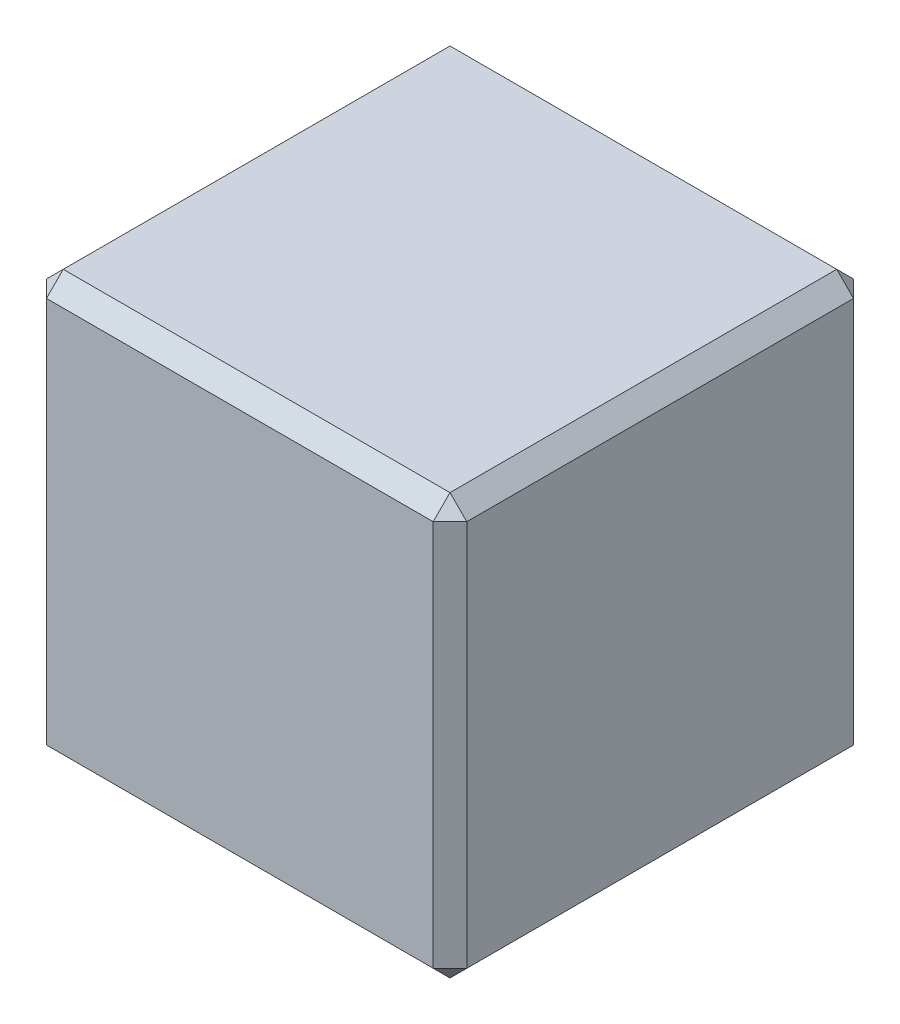
ISO-10303-21;
HEADER;
FILE_DESCRIPTION(('STEP AP214'),'2;1');
FILE_NAME('part.step','',(''),(''),'','','');
FILE_SCHEMA(('AUTOMOTIVE_DESIGN { 1 0 10303 214 1 1 1 1 }'));
ENDSEC;
DATA;
#1=APPLICATION_CONTEXT('core data for automotive mechanical design processes');
#2=APPLICATION_PROTOCOL_DEFINITION('international standard','automotive_design',2000,#1);
#3=PRODUCT_CONTEXT('',#1,'mechanical');
#4=PRODUCT('Part','Part','',(#3));
#5=PRODUCT_RELATED_PRODUCT_CATEGORY('part','',(#4));
#6=PRODUCT_DEFINITION_FORMATION('','',#4);
#7=PRODUCT_DEFINITION_CONTEXT('part definition',#1,'design');
#8=PRODUCT_DEFINITION('design','',#6,#7);
#9=PRODUCT_DEFINITION_SHAPE('','',#8);
#10=(LENGTH_UNIT() NAMED_UNIT(*) SI_UNIT(.MILLI.,.METRE.));
#11=(NAMED_UNIT(*) PLANE_ANGLE_UNIT() SI_UNIT($,.RADIAN.));
#12=(NAMED_UNIT(*) SI_UNIT($,.STERADIAN.) SOLID_ANGLE_UNIT());
#13=UNCERTAINTY_MEASURE_WITH_UNIT(LENGTH_MEASURE(1.E-05),#10,'distance_accuracy_value','');
#14=(GEOMETRIC_REPRESENTATION_CONTEXT(3) GLOBAL_UNCERTAINTY_ASSIGNED_CONTEXT((#13)) GLOBAL_UNIT_ASSIGNED_CONTEXT((#10,
#11,#12)) REPRESENTATION_CONTEXT('',''));
#15=CARTESIAN_POINT('',(0.,0.,0.));
#16=DIRECTION('',(0.,0.,1.));
#17=DIRECTION('',(1.,0.,0.));
#18=AXIS2_PLACEMENT_3D('',#15,#16,#17);
#19=CARTESIAN_POINT('',(0.,0.,50.));
#20=DIRECTION('',(1.,0.,0.));
#21=DIRECTION('',(0.,1.,0.));
#22=AXIS2_PLACEMENT_3D('',#19,#20,#21);
#23=PLANE('',#22);
#24=DIRECTION('',(0.,-1.,0.));
#25=VECTOR('',#24,1.);
#26=CARTESIAN_POINT('',(0.,0.,2.00000000000002));
#27=LINE('',#26,#25);
#28=CARTESIAN_POINT('',(-1.86517468137026E-13,48.,2.00000000000002));
#29=VERTEX_POINT('',#28);
#30=CARTESIAN_POINT('',(0.,2.00000000000001,2.00000000000002));
#31=VERTEX_POINT('',#30);
#32=EDGE_CURVE('E171',#29,#31,#27,.T.);
#33=ORIENTED_EDGE('',*,*,#32,.T.);
#34=DIRECTION('',(0.,0.,1.));
#35=VECTOR('',#34,1.);
#36=CARTESIAN_POINT('',(0.,2.00000000000001,50.));
#37=LINE('',#36,#35);
#38=CARTESIAN_POINT('',(0.,2.00000000000001,48.));
#39=VERTEX_POINT('',#38);
#40=EDGE_CURVE('E173',#31,#39,#37,.T.);
#41=ORIENTED_EDGE('',*,*,#40,.T.);
#42=DIRECTION('',(0.,1.,0.));
#43=VECTOR('',#42,1.);
#44=CARTESIAN_POINT('',(0.,0.,48.));
#45=LINE('',#44,#43);
#46=CARTESIAN_POINT('',(-1.86517468137026E-13,48.,48.));
#47=VERTEX_POINT('',#46);
#48=EDGE_CURVE('E167',#39,#47,#45,.T.);
#49=ORIENTED_EDGE('',*,*,#48,.T.);
#50=DIRECTION('',(0.,0.,-1.));
#51=VECTOR('',#50,1.);
#52=CARTESIAN_POINT('',(-1.86517468137026E-13,48.,50.));
#53=LINE('',#52,#51);
#54=EDGE_CURVE('E169',#47,#29,#53,.T.);
#55=ORIENTED_EDGE('',*,*,#54,.T.);
#56=EDGE_LOOP('',(#33,#41,#49,#55));
#57=FACE_BOUND('',#56,.T.);
#58=ADVANCED_FACE('F35',(#57),#23,.F.);
#59=CARTESIAN_POINT('',(0.,0.,50.));
#60=DIRECTION('',(0.,1.,0.));
#61=DIRECTION('',(0.,0.,1.));
#62=AXIS2_PLACEMENT_3D('',#59,#60,#61);
#63=PLANE('',#62);
#64=DIRECTION('',(-1.,0.,0.));
#65=VECTOR('',#64,1.);
#66=CARTESIAN_POINT('',(0.,0.,48.));
#67=LINE('',#66,#65);
#68=CARTESIAN_POINT('',(47.9999999999998,0.,48.));
#69=VERTEX_POINT('',#68);
#70=CARTESIAN_POINT('',(1.99999999999999,0.,48.));
#71=VERTEX_POINT('',#70);
#72=EDGE_CURVE('E128',#69,#71,#67,.T.);
#73=ORIENTED_EDGE('',*,*,#72,.T.);
#74=DIRECTION('',(0.,0.,-1.));
#75=VECTOR('',#74,1.);
#76=CARTESIAN_POINT('',(1.99999999999999,0.,50.));
#77=LINE('',#76,#75);
#78=CARTESIAN_POINT('',(1.99999999999999,0.,2.));
#79=VERTEX_POINT('',#78);
#80=EDGE_CURVE('E165',#71,#79,#77,.T.);
#81=ORIENTED_EDGE('',*,*,#80,.T.);
#82=DIRECTION('',(1.,0.,0.));
#83=VECTOR('',#82,1.);
#84=CARTESIAN_POINT('',(49.9999999999998,0.,2.));
#85=LINE('',#84,#83);
#86=CARTESIAN_POINT('',(47.9999999999998,0.,2.));
#87=VERTEX_POINT('',#86);
#88=EDGE_CURVE('E131',#79,#87,#85,.T.);
#89=ORIENTED_EDGE('',*,*,#88,.T.);
#90=DIRECTION('',(0.,0.,1.));
#91=VECTOR('',#90,1.);
#92=CARTESIAN_POINT('',(47.9999999999998,0.,50.));
#93=LINE('',#92,#91);
#94=EDGE_CURVE('E123',#87,#69,#93,.T.);
#95=ORIENTED_EDGE('',*,*,#94,.T.);
#96=EDGE_LOOP('',(#73,#81,#89,#95));
#97=FACE_BOUND('',#96,.T.);
#98=ADVANCED_FACE('F125',(#97),#63,.F.);
#99=CARTESIAN_POINT('',(49.9999999999998,0.,50.));
#100=DIRECTION('',(-1.,0.,0.));
#101=DIRECTION('',(0.,-1.,0.));
#102=AXIS2_PLACEMENT_3D('',#99,#100,#101);
#103=PLANE('',#102);
#104=DIRECTION('',(0.,-1.,0.));
#105=VECTOR('',#104,1.);
#106=CARTESIAN_POINT('',(49.9999999999998,0.,48.));
#107=LINE('',#106,#105);
#108=CARTESIAN_POINT('',(49.9999999999998,48.,48.));
#109=VERTEX_POINT('',#108);
#110=CARTESIAN_POINT('',(49.9999999999998,2.,48.));
#111=VERTEX_POINT('',#110);
#112=EDGE_CURVE('E185',#109,#111,#107,.T.);
#113=ORIENTED_EDGE('',*,*,#112,.T.);
#114=DIRECTION('',(0.,0.,-1.));
#115=VECTOR('',#114,1.);
#116=CARTESIAN_POINT('',(49.9999999999998,2.,50.));
#117=LINE('',#116,#115);
#118=CARTESIAN_POINT('',(49.9999999999998,2.,2.));
#119=VERTEX_POINT('',#118);
#120=EDGE_CURVE('E142',#111,#119,#117,.T.);
#121=ORIENTED_EDGE('',*,*,#120,.T.);
#122=DIRECTION('',(0.,1.,0.));
#123=VECTOR('',#122,1.);
#124=CARTESIAN_POINT('',(49.9999999999998,50.,2.));
#125=LINE('',#124,#123);
#126=CARTESIAN_POINT('',(49.9999999999998,48.,2.));
#127=VERTEX_POINT('',#126);
#128=EDGE_CURVE('E189',#119,#127,#125,.T.);
#129=ORIENTED_EDGE('',*,*,#128,.T.);
#130=DIRECTION('',(0.,0.,1.));
#131=VECTOR('',#130,1.);
#132=CARTESIAN_POINT('',(49.9999999999998,48.,50.));
#133=LINE('',#132,#131);
#134=EDGE_CURVE('E187',#127,#109,#133,.T.);
#135=ORIENTED_EDGE('',*,*,#134,.T.);
#136=EDGE_LOOP('',(#113,#121,#129,#135));
#137=FACE_BOUND('',#136,.T.);
#138=ADVANCED_FACE('F328',(#137),#103,.F.);
#139=CARTESIAN_POINT('',(-1.94289029309402E-13,50.,50.));
#140=DIRECTION('',(0.,-1.,0.));
#141=DIRECTION('',(0.,0.,-1.));
#142=AXIS2_PLACEMENT_3D('',#139,#140,#141);
#143=PLANE('',#142);
#144=DIRECTION('',(1.,0.,0.));
#145=VECTOR('',#144,1.);
#146=CARTESIAN_POINT('',(-1.94289029309402E-13,50.,48.));
#147=LINE('',#146,#145);
#148=CARTESIAN_POINT('',(1.99999999999982,50.,48.));
#149=VERTEX_POINT('',#148);
#150=CARTESIAN_POINT('',(47.9999999999998,50.,48.));
#151=VERTEX_POINT('',#150);
#152=EDGE_CURVE('E192',#149,#151,#147,.T.);
#153=ORIENTED_EDGE('',*,*,#152,.T.);
#154=DIRECTION('',(0.,0.,-1.));
#155=VECTOR('',#154,1.);
#156=CARTESIAN_POINT('',(47.9999999999998,50.,50.));
#157=LINE('',#156,#155);
#158=CARTESIAN_POINT('',(47.9999999999998,50.,2.));
#159=VERTEX_POINT('',#158);
#160=EDGE_CURVE('E198',#151,#159,#157,.T.);
#161=ORIENTED_EDGE('',*,*,#160,.T.);
#162=DIRECTION('',(-1.,0.,0.));
#163=VECTOR('',#162,1.);
#164=CARTESIAN_POINT('',(-1.94289029309402E-13,50.,2.));
#165=LINE('',#164,#163);
#166=CARTESIAN_POINT('',(1.99999999999982,50.,2.));
#167=VERTEX_POINT('',#166);
#168=EDGE_CURVE('E196',#159,#167,#165,.T.);
#169=ORIENTED_EDGE('',*,*,#168,.T.);
#170=DIRECTION('',(0.,0.,1.));
#171=VECTOR('',#170,1.);
#172=CARTESIAN_POINT('',(1.99999999999982,50.,50.));
#173=LINE('',#172,#171);
#174=EDGE_CURVE('E194',#167,#149,#173,.T.);
#175=ORIENTED_EDGE('',*,*,#174,.T.);
#176=EDGE_LOOP('',(#153,#161,#169,#175));
#177=FACE_BOUND('',#176,.T.);
#178=ADVANCED_FACE('F276',(#177),#143,.F.);
#179=CARTESIAN_POINT('',(0.,0.,50.));
#180=DIRECTION('',(0.,0.,-1.));
#181=DIRECTION('',(-1.,0.,0.));
#182=AXIS2_PLACEMENT_3D('',#179,#180,#181);
#183=PLANE('',#182);
#184=DIRECTION('',(0.,1.,0.));
#185=VECTOR('',#184,1.);
#186=CARTESIAN_POINT('',(47.9999999999998,0.,50.));
#187=LINE('',#186,#185);
#188=CARTESIAN_POINT('',(47.9999999999998,2.,50.));
#189=VERTEX_POINT('',#188);
#190=CARTESIAN_POINT('',(47.9999999999998,48.,50.));
#191=VERTEX_POINT('',#190);
#192=EDGE_CURVE('E45',#189,#191,#187,.T.);
#193=ORIENTED_EDGE('',*,*,#192,.T.);
#194=DIRECTION('',(-1.,0.,0.));
#195=VECTOR('',#194,1.);
#196=CARTESIAN_POINT('',(0.,48.,50.));
#197=LINE('',#196,#195);
#198=CARTESIAN_POINT('',(1.99999999999982,48.,50.));
#199=VERTEX_POINT('',#198);
#200=EDGE_CURVE('E11',#191,#199,#197,.T.);
#201=ORIENTED_EDGE('',*,*,#200,.T.);
#202=DIRECTION('',(0.,-1.,0.));
#203=VECTOR('',#202,1.);
#204=CARTESIAN_POINT('',(2.,0.,50.));
#205=LINE('',#204,#203);
#206=CARTESIAN_POINT('',(1.99999999999999,2.,50.));
#207=VERTEX_POINT('',#206);
#208=EDGE_CURVE('E201',#199,#207,#205,.T.);
#209=ORIENTED_EDGE('',*,*,#208,.T.);
#210=DIRECTION('',(1.,0.,0.));
#211=VECTOR('',#210,1.);
#212=CARTESIAN_POINT('',(0.,2.,50.));
#213=LINE('',#212,#211);
#214=EDGE_CURVE('E56',#207,#189,#213,.T.);
#215=ORIENTED_EDGE('',*,*,#214,.T.);
#216=EDGE_LOOP('',(#193,#201,#209,#215));
#217=FACE_BOUND('',#216,.T.);
#218=ADVANCED_FACE('F291',(#217),#183,.F.);
#219=CARTESIAN_POINT('',(0.,0.,0.));
#220=DIRECTION('',(0.,0.,-1.));
#221=DIRECTION('',(-1.,0.,0.));
#222=AXIS2_PLACEMENT_3D('',#219,#220,#221);
#223=PLANE('',#222);
#224=DIRECTION('',(0.,-1.,0.));
#225=VECTOR('',#224,1.);
#226=CARTESIAN_POINT('',(47.9999999999998,0.,0.));
#227=LINE('',#226,#225);
#228=CARTESIAN_POINT('',(47.9999999999998,48.,0.));
#229=VERTEX_POINT('',#228);
#230=CARTESIAN_POINT('',(47.9999999999998,2.00000000000002,0.));
#231=VERTEX_POINT('',#230);
#232=EDGE_CURVE('E178',#229,#231,#227,.T.);
#233=ORIENTED_EDGE('',*,*,#232,.T.);
#234=DIRECTION('',(-1.,0.,0.));
#235=VECTOR('',#234,1.);
#236=CARTESIAN_POINT('',(0.,2.00000000000002,0.));
#237=LINE('',#236,#235);
#238=CARTESIAN_POINT('',(1.99999999999999,2.00000000000002,0.));
#239=VERTEX_POINT('',#238);
#240=EDGE_CURVE('E182',#231,#239,#237,.T.);
#241=ORIENTED_EDGE('',*,*,#240,.T.);
#242=DIRECTION('',(0.,1.,0.));
#243=VECTOR('',#242,1.);
#244=CARTESIAN_POINT('',(1.99999999999981,50.,0.));
#245=LINE('',#244,#243);
#246=CARTESIAN_POINT('',(1.99999999999982,48.,0.));
#247=VERTEX_POINT('',#246);
#248=EDGE_CURVE('E180',#239,#247,#245,.T.);
#249=ORIENTED_EDGE('',*,*,#248,.T.);
#250=DIRECTION('',(1.,0.,0.));
#251=VECTOR('',#250,1.);
#252=CARTESIAN_POINT('',(49.9999999999998,48.,0.));
#253=LINE('',#252,#251);
#254=EDGE_CURVE('E176',#247,#229,#253,.T.);
#255=ORIENTED_EDGE('',*,*,#254,.T.);
#256=EDGE_LOOP('',(#233,#241,#249,#255));
#257=FACE_BOUND('',#256,.T.);
#258=ADVANCED_FACE('F267',(#257),#223,.T.);
#259=CARTESIAN_POINT('',(47.9999999999998,50.,50.));
#260=DIRECTION('',(-0.70710678118655,-0.707106781186545,0.));
#261=DIRECTION('',(0.,0.,-1.));
#262=AXIS2_PLACEMENT_3D('',#259,#260,#261);
#263=PLANE('',#262);
#264=DIRECTION('',(0.707106781186545,-0.70710678118655,0.));
#265=VECTOR('',#264,1.);
#266=CARTESIAN_POINT('',(49.9999999999998,48.,48.));
#267=LINE('',#266,#265);
#268=EDGE_CURVE('E40',#109,#151,#267,.F.);
#269=ORIENTED_EDGE('',*,*,#268,.F.);
#270=ORIENTED_EDGE('',*,*,#134,.F.);
#271=DIRECTION('',(-0.707106781186545,0.70710678118655,0.));
#272=VECTOR('',#271,1.);
#273=CARTESIAN_POINT('',(49.9999999999998,48.,2.));
#274=LINE('',#273,#272);
#275=EDGE_CURVE('E162',#159,#127,#274,.F.);
#276=ORIENTED_EDGE('',*,*,#275,.F.);
#277=ORIENTED_EDGE('',*,*,#160,.F.);
#278=EDGE_LOOP('',(#269,#270,#276,#277));
#279=FACE_BOUND('',#278,.T.);
#280=ADVANCED_FACE('F38',(#279),#263,.F.);
#281=CARTESIAN_POINT('',(49.9999999999998,48.,48.));
#282=DIRECTION('',(0.57735026918963,0.577350269189626,0.577350269189622));
#283=DIRECTION('',(-0.707106781186545,0.70710678118655,0.));
#284=AXIS2_PLACEMENT_3D('',#281,#282,#283);
#285=PLANE('',#284);
#286=DIRECTION('',(-0.707106781186545,0.,0.70710678118655));
#287=VECTOR('',#286,1.);
#288=CARTESIAN_POINT('',(49.9999999999998,48.,48.));
#289=LINE('',#288,#287);
#290=EDGE_CURVE('E247',#109,#191,#289,.T.);
#291=ORIENTED_EDGE('',*,*,#290,.F.);
#292=ORIENTED_EDGE('',*,*,#268,.T.);
#293=DIRECTION('',(0.,0.707106781186545,-0.70710678118655));
#294=VECTOR('',#293,1.);
#295=CARTESIAN_POINT('',(47.9999999999998,49.,49.));
#296=LINE('',#295,#294);
#297=EDGE_CURVE('E249',#191,#151,#296,.T.);
#298=ORIENTED_EDGE('',*,*,#297,.F.);
#299=EDGE_LOOP('',(#291,#292,#298));
#300=FACE_BOUND('',#299,.T.);
#301=ADVANCED_FACE('F412',(#300),#285,.T.);
#302=CARTESIAN_POINT('',(49.9999999999998,48.,2.));
#303=DIRECTION('',(0.577350269189626,0.577350269189622,-0.57735026918963));
#304=DIRECTION('',(-0.70710678118655,0.,-0.707106781186545));
#305=AXIS2_PLACEMENT_3D('',#302,#303,#304);
#306=PLANE('',#305);
#307=DIRECTION('',(0.,0.70710678118655,0.707106781186545));
#308=VECTOR('',#307,1.);
#309=CARTESIAN_POINT('',(47.9999999999998,49.,1.));
#310=LINE('',#309,#308);
#311=EDGE_CURVE('E241',#159,#229,#310,.F.);
#312=ORIENTED_EDGE('',*,*,#311,.F.);
#313=ORIENTED_EDGE('',*,*,#275,.T.);
#314=DIRECTION('',(-0.70710678118655,0.,-0.707106781186545));
#315=VECTOR('',#314,1.);
#316=CARTESIAN_POINT('',(49.9999999999998,48.,2.));
#317=LINE('',#316,#315);
#318=EDGE_CURVE('E244',#229,#127,#317,.F.);
#319=ORIENTED_EDGE('',*,*,#318,.F.);
#320=EDGE_LOOP('',(#312,#313,#319));
#321=FACE_BOUND('',#320,.T.);
#322=ADVANCED_FACE('F256',(#321),#306,.T.);
#323=CARTESIAN_POINT('',(0.,48.,50.));
#324=DIRECTION('',(0.,-0.70710678118655,-0.707106781186545));
#325=DIRECTION('',(-1.,0.,0.));
#326=AXIS2_PLACEMENT_3D('',#323,#324,#325);
#327=PLANE('',#326);
#328=ORIENTED_EDGE('',*,*,#297,.T.);
#329=ORIENTED_EDGE('',*,*,#152,.F.);
#330=DIRECTION('',(0.,-0.707106781186545,0.70710678118655));
#331=VECTOR('',#330,1.);
#332=CARTESIAN_POINT('',(1.99999999999982,50.,48.));
#333=LINE('',#332,#331);
#334=EDGE_CURVE('E235',#199,#149,#333,.F.);
#335=ORIENTED_EDGE('',*,*,#334,.F.);
#336=ORIENTED_EDGE('',*,*,#200,.F.);
#337=EDGE_LOOP('',(#328,#329,#335,#336));
#338=FACE_BOUND('',#337,.T.);
#339=ADVANCED_FACE('F290',(#338),#327,.F.);
#340=CARTESIAN_POINT('',(47.9999999999998,0.,50.));
#341=DIRECTION('',(-0.70710678118655,0.,-0.707106781186545));
#342=DIRECTION('',(0.,1.,0.));
#343=AXIS2_PLACEMENT_3D('',#340,#341,#342);
#344=PLANE('',#343);
#345=ORIENTED_EDGE('',*,*,#290,.T.);
#346=ORIENTED_EDGE('',*,*,#192,.F.);
#347=DIRECTION('',(0.707106781186545,0.,-0.70710678118655));
#348=VECTOR('',#347,1.);
#349=CARTESIAN_POINT('',(48.9999999999998,2.,49.));
#350=LINE('',#349,#348);
#351=EDGE_CURVE('E146',#111,#189,#350,.F.);
#352=ORIENTED_EDGE('',*,*,#351,.F.);
#353=ORIENTED_EDGE('',*,*,#112,.F.);
#354=EDGE_LOOP('',(#345,#346,#352,#353));
#355=FACE_BOUND('',#354,.T.);
#356=ADVANCED_FACE('F401',(#355),#344,.F.);
#357=CARTESIAN_POINT('',(49.9999999999998,2.,50.));
#358=DIRECTION('',(-0.707106781186545,0.70710678118655,0.));
#359=DIRECTION('',(0.,0.,-1.));
#360=AXIS2_PLACEMENT_3D('',#357,#358,#359);
#361=PLANE('',#360);
#362=DIRECTION('',(0.70710678118655,0.707106781186545,0.));
#363=VECTOR('',#362,1.);
#364=CARTESIAN_POINT('',(47.9999999999998,0.,2.));
#365=LINE('',#364,#363);
#366=EDGE_CURVE('E147',#119,#87,#365,.F.);
#367=ORIENTED_EDGE('',*,*,#366,.F.);
#368=ORIENTED_EDGE('',*,*,#120,.F.);
#369=DIRECTION('',(-0.70710678118655,-0.707106781186545,0.));
#370=VECTOR('',#369,1.);
#371=CARTESIAN_POINT('',(47.9999999999998,0.,48.));
#372=LINE('',#371,#370);
#373=EDGE_CURVE('E138',#69,#111,#372,.F.);
#374=ORIENTED_EDGE('',*,*,#373,.F.);
#375=ORIENTED_EDGE('',*,*,#94,.F.);
#376=EDGE_LOOP('',(#367,#368,#374,#375));
#377=FACE_BOUND('',#376,.T.);
#378=ADVANCED_FACE('F140',(#377),#361,.F.);
#379=CARTESIAN_POINT('',(49.9999999999998,0.,2.));
#380=DIRECTION('',(0.707106781186545,0.,-0.70710678118655));
#381=DIRECTION('',(0.,-1.,0.));
#382=AXIS2_PLACEMENT_3D('',#379,#380,#381);
#383=PLANE('',#382);
#384=ORIENTED_EDGE('',*,*,#318,.T.);
#385=ORIENTED_EDGE('',*,*,#128,.F.);
#386=DIRECTION('',(0.70710678118655,0.,0.707106781186545));
#387=VECTOR('',#386,1.);
#388=CARTESIAN_POINT('',(48.9999999999998,2.00000000000001,1.));
#389=LINE('',#388,#387);
#390=EDGE_CURVE('E231',#231,#119,#389,.T.);
#391=ORIENTED_EDGE('',*,*,#390,.F.);
#392=ORIENTED_EDGE('',*,*,#232,.F.);
#393=EDGE_LOOP('',(#384,#385,#391,#392));
#394=FACE_BOUND('',#393,.T.);
#395=ADVANCED_FACE('F263',(#394),#383,.T.);
#396=CARTESIAN_POINT('',(-1.94289029309402E-13,50.,2.));
#397=DIRECTION('',(0.,0.707106781186545,-0.70710678118655));
#398=DIRECTION('',(1.,0.,0.));
#399=AXIS2_PLACEMENT_3D('',#396,#397,#398);
#400=PLANE('',#399);
#401=ORIENTED_EDGE('',*,*,#311,.T.);
#402=ORIENTED_EDGE('',*,*,#254,.F.);
#403=DIRECTION('',(0.,-0.70710678118655,-0.707106781186545));
#404=VECTOR('',#403,1.);
#405=CARTESIAN_POINT('',(1.99999999999982,48.,0.));
#406=LINE('',#405,#404);
#407=EDGE_CURVE('E228',#167,#247,#406,.T.);
#408=ORIENTED_EDGE('',*,*,#407,.F.);
#409=ORIENTED_EDGE('',*,*,#168,.F.);
#410=EDGE_LOOP('',(#401,#402,#408,#409));
#411=FACE_BOUND('',#410,.T.);
#412=ADVANCED_FACE('F273',(#411),#400,.T.);
#413=CARTESIAN_POINT('',(-1.86517468137026E-13,48.,50.));
#414=DIRECTION('',(0.707106781186551,-0.707106781186544,0.));
#415=DIRECTION('',(0.,0.,-1.));
#416=AXIS2_PLACEMENT_3D('',#413,#414,#415);
#417=PLANE('',#416);
#418=DIRECTION('',(0.707106781186544,0.707106781186551,0.));
#419=VECTOR('',#418,1.);
#420=CARTESIAN_POINT('',(1.99999999999982,50.,48.));
#421=LINE('',#420,#419);
#422=EDGE_CURVE('E238',#149,#47,#421,.F.);
#423=ORIENTED_EDGE('',*,*,#422,.F.);
#424=ORIENTED_EDGE('',*,*,#174,.F.);
#425=DIRECTION('',(-0.707106781186544,-0.707106781186551,0.));
#426=VECTOR('',#425,1.);
#427=CARTESIAN_POINT('',(0.999999999999814,49.,2.00000000000001));
#428=LINE('',#427,#426);
#429=EDGE_CURVE('E225',#29,#167,#428,.F.);
#430=ORIENTED_EDGE('',*,*,#429,.F.);
#431=ORIENTED_EDGE('',*,*,#54,.F.);
#432=EDGE_LOOP('',(#423,#424,#430,#431));
#433=FACE_BOUND('',#432,.T.);
#434=ADVANCED_FACE('F281',(#433),#417,.F.);
#435=CARTESIAN_POINT('',(1.99999999999982,50.,48.));
#436=DIRECTION('',(-0.577350269189631,0.577350269189625,0.577350269189621));
#437=DIRECTION('',(-0.707106781186544,-0.707106781186551,0.));
#438=AXIS2_PLACEMENT_3D('',#435,#436,#437);
#439=PLANE('',#438);
#440=ORIENTED_EDGE('',*,*,#334,.T.);
#441=ORIENTED_EDGE('',*,*,#422,.T.);
#442=DIRECTION('',(-0.707106781186545,0.,-0.70710678118655));
#443=VECTOR('',#442,1.);
#444=CARTESIAN_POINT('',(0.999999999999818,48.,49.));
#445=LINE('',#444,#443);
#446=EDGE_CURVE('E153',#199,#47,#445,.T.);
#447=ORIENTED_EDGE('',*,*,#446,.F.);
#448=EDGE_LOOP('',(#440,#441,#447));
#449=FACE_BOUND('',#448,.T.);
#450=ADVANCED_FACE('F287',(#449),#439,.T.);
#451=CARTESIAN_POINT('',(47.9999999999998,0.,48.));
#452=DIRECTION('',(0.577350269189626,-0.57735026918963,0.577350269189622));
#453=DIRECTION('',(0.70710678118655,0.707106781186545,0.));
#454=AXIS2_PLACEMENT_3D('',#451,#452,#453);
#455=PLANE('',#454);
#456=ORIENTED_EDGE('',*,*,#373,.T.);
#457=ORIENTED_EDGE('',*,*,#351,.T.);
#458=DIRECTION('',(0.,0.707106781186545,0.70710678118655));
#459=VECTOR('',#458,1.);
#460=CARTESIAN_POINT('',(47.9999999999998,0.,48.));
#461=LINE('',#460,#459);
#462=EDGE_CURVE('E150',#69,#189,#461,.T.);
#463=ORIENTED_EDGE('',*,*,#462,.F.);
#464=EDGE_LOOP('',(#456,#457,#463));
#465=FACE_BOUND('',#464,.T.);
#466=ADVANCED_FACE('F151',(#465),#455,.T.);
#467=CARTESIAN_POINT('',(47.9999999999998,0.,2.));
#468=DIRECTION('',(0.577350269189622,-0.577350269189626,-0.57735026918963));
#469=DIRECTION('',(0.,0.70710678118655,-0.707106781186545));
#470=AXIS2_PLACEMENT_3D('',#467,#468,#469);
#471=PLANE('',#470);
#472=ORIENTED_EDGE('',*,*,#390,.T.);
#473=ORIENTED_EDGE('',*,*,#366,.T.);
#474=DIRECTION('',(0.,0.70710678118655,-0.707106781186545));
#475=VECTOR('',#474,1.);
#476=CARTESIAN_POINT('',(47.9999999999998,0.,2.));
#477=LINE('',#476,#475);
#478=EDGE_CURVE('E154',#231,#87,#477,.F.);
#479=ORIENTED_EDGE('',*,*,#478,.F.);
#480=EDGE_LOOP('',(#472,#473,#479));
#481=FACE_BOUND('',#480,.T.);
#482=ADVANCED_FACE('F310',(#481),#471,.T.);
#483=CARTESIAN_POINT('',(1.99999999999982,48.,0.));
#484=DIRECTION('',(-0.577350269189631,0.577350269189621,-0.577350269189625));
#485=DIRECTION('',(-0.707106781186544,0.,0.707106781186551));
#486=AXIS2_PLACEMENT_3D('',#483,#484,#485);
#487=PLANE('',#486);
#488=ORIENTED_EDGE('',*,*,#429,.T.);
#489=ORIENTED_EDGE('',*,*,#407,.T.);
#490=DIRECTION('',(-0.707106781186545,0.,0.70710678118655));
#491=VECTOR('',#490,1.);
#492=CARTESIAN_POINT('',(1.99999999999982,48.,0.));
#493=LINE('',#492,#491);
#494=EDGE_CURVE('E218',#29,#247,#493,.F.);
#495=ORIENTED_EDGE('',*,*,#494,.F.);
#496=EDGE_LOOP('',(#488,#489,#495));
#497=FACE_BOUND('',#496,.T.);
#498=ADVANCED_FACE('F312',(#497),#487,.T.);
#499=CARTESIAN_POINT('',(2.,0.,50.));
#500=DIRECTION('',(0.70710678118655,0.,-0.707106781186545));
#501=DIRECTION('',(0.,-1.,0.));
#502=AXIS2_PLACEMENT_3D('',#499,#500,#501);
#503=PLANE('',#502);
#504=ORIENTED_EDGE('',*,*,#446,.T.);
#505=ORIENTED_EDGE('',*,*,#48,.F.);
#506=DIRECTION('',(0.707106781186545,0.,0.70710678118655));
#507=VECTOR('',#506,1.);
#508=CARTESIAN_POINT('',(0.,2.00000000000001,48.));
#509=LINE('',#508,#507);
#510=EDGE_CURVE('E215',#207,#39,#509,.F.);
#511=ORIENTED_EDGE('',*,*,#510,.F.);
#512=ORIENTED_EDGE('',*,*,#208,.F.);
#513=EDGE_LOOP('',(#504,#505,#511,#512));
#514=FACE_BOUND('',#513,.T.);
#515=ADVANCED_FACE('F295',(#514),#503,.F.);
#516=CARTESIAN_POINT('',(0.,2.,50.));
#517=DIRECTION('',(0.,0.70710678118655,-0.707106781186545));
#518=DIRECTION('',(1.,0.,0.));
#519=AXIS2_PLACEMENT_3D('',#516,#517,#518);
#520=PLANE('',#519);
#521=ORIENTED_EDGE('',*,*,#462,.T.);
#522=ORIENTED_EDGE('',*,*,#214,.F.);
#523=DIRECTION('',(0.,-0.707106781186545,-0.70710678118655));
#524=VECTOR('',#523,1.);
#525=CARTESIAN_POINT('',(1.99999999999999,0.999999999999997,49.));
#526=LINE('',#525,#524);
#527=EDGE_CURVE('E158',#71,#207,#526,.F.);
#528=ORIENTED_EDGE('',*,*,#527,.F.);
#529=ORIENTED_EDGE('',*,*,#72,.F.);
#530=EDGE_LOOP('',(#521,#522,#528,#529));
#531=FACE_BOUND('',#530,.T.);
#532=ADVANCED_FACE('F156',(#531),#520,.F.);
#533=CARTESIAN_POINT('',(0.,0.,2.));
#534=DIRECTION('',(0.,-0.707106781186545,-0.70710678118655));
#535=DIRECTION('',(-1.,0.,0.));
#536=AXIS2_PLACEMENT_3D('',#533,#534,#535);
#537=PLANE('',#536);
#538=ORIENTED_EDGE('',*,*,#478,.T.);
#539=ORIENTED_EDGE('',*,*,#88,.F.);
#540=DIRECTION('',(0.,-0.70710678118655,0.707106781186545));
#541=VECTOR('',#540,1.);
#542=CARTESIAN_POINT('',(1.99999999999999,0.,2.));
#543=LINE('',#542,#541);
#544=EDGE_CURVE('E211',#239,#79,#543,.T.);
#545=ORIENTED_EDGE('',*,*,#544,.F.);
#546=ORIENTED_EDGE('',*,*,#240,.F.);
#547=EDGE_LOOP('',(#538,#539,#545,#546));
#548=FACE_BOUND('',#547,.T.);
#549=ADVANCED_FACE('F308',(#548),#537,.T.);
#550=CARTESIAN_POINT('',(0.,0.,2.00000000000002));
#551=DIRECTION('',(-0.70710678118655,0.,-0.707106781186545));
#552=DIRECTION('',(0.,1.,0.));
#553=AXIS2_PLACEMENT_3D('',#550,#551,#552);
#554=PLANE('',#553);
#555=ORIENTED_EDGE('',*,*,#494,.T.);
#556=ORIENTED_EDGE('',*,*,#248,.F.);
#557=DIRECTION('',(0.707106781186545,0.,-0.70710678118655));
#558=VECTOR('',#557,1.);
#559=CARTESIAN_POINT('',(0.999999999999989,2.00000000000001,1.00000000000001));
#560=LINE('',#559,#558);
#561=EDGE_CURVE('E209',#31,#239,#560,.T.);
#562=ORIENTED_EDGE('',*,*,#561,.F.);
#563=ORIENTED_EDGE('',*,*,#32,.F.);
#564=EDGE_LOOP('',(#555,#556,#562,#563));
#565=FACE_BOUND('',#564,.T.);
#566=ADVANCED_FACE('F348',(#565),#554,.T.);
#567=CARTESIAN_POINT('',(0.,2.00000000000001,48.));
#568=DIRECTION('',(-0.577350269189628,-0.577350269189627,0.577350269189623));
#569=DIRECTION('',(0.707106781186546,-0.707106781186549,0.));
#570=AXIS2_PLACEMENT_3D('',#567,#568,#569);
#571=PLANE('',#570);
#572=ORIENTED_EDGE('',*,*,#527,.T.);
#573=ORIENTED_EDGE('',*,*,#510,.T.);
#574=DIRECTION('',(-0.707106781186546,0.707106781186549,0.));
#575=VECTOR('',#574,1.);
#576=CARTESIAN_POINT('',(0.,2.00000000000001,48.));
#577=LINE('',#576,#575);
#578=EDGE_CURVE('E207',#71,#39,#577,.T.);
#579=ORIENTED_EDGE('',*,*,#578,.F.);
#580=EDGE_LOOP('',(#572,#573,#579));
#581=FACE_BOUND('',#580,.T.);
#582=ADVANCED_FACE('F297',(#581),#571,.T.);
#583=CARTESIAN_POINT('',(1.99999999999999,0.,2.));
#584=DIRECTION('',(-0.577350269189628,-0.577350269189623,-0.577350269189627));
#585=DIRECTION('',(-0.707106781186546,0.,0.707106781186549));
#586=AXIS2_PLACEMENT_3D('',#583,#584,#585);
#587=PLANE('',#586);
#588=ORIENTED_EDGE('',*,*,#561,.T.);
#589=ORIENTED_EDGE('',*,*,#544,.T.);
#590=DIRECTION('',(0.707106781186546,-0.707106781186548,0.));
#591=VECTOR('',#590,1.);
#592=CARTESIAN_POINT('',(1.99999999999999,0.,2.));
#593=LINE('',#592,#591);
#594=EDGE_CURVE('E205',#31,#79,#593,.T.);
#595=ORIENTED_EDGE('',*,*,#594,.F.);
#596=EDGE_LOOP('',(#588,#589,#595));
#597=FACE_BOUND('',#596,.T.);
#598=ADVANCED_FACE('F305',(#597),#587,.T.);
#599=CARTESIAN_POINT('',(1.99999999999999,0.,50.));
#600=DIRECTION('',(0.707106781186549,0.707106781186546,0.));
#601=DIRECTION('',(0.,0.,-1.));
#602=AXIS2_PLACEMENT_3D('',#599,#600,#601);
#603=PLANE('',#602);
#604=ORIENTED_EDGE('',*,*,#578,.T.);
#605=ORIENTED_EDGE('',*,*,#40,.F.);
#606=ORIENTED_EDGE('',*,*,#594,.T.);
#607=ORIENTED_EDGE('',*,*,#80,.F.);
#608=EDGE_LOOP('',(#604,#605,#606,#607));
#609=FACE_BOUND('',#608,.T.);
#610=ADVANCED_FACE('F301',(#609),#603,.F.);
#611=CLOSED_SHELL('',(#58,#98,#138,#178,#218,#258,#280,#301,#322,#339,#356,#378,#395,#412,#434,
#450,#466,#482,#498,#515,#532,#549,#566,#582,#598,#610));
#612=MANIFOLD_SOLID_BREP('B2',#611);
#613=ADVANCED_BREP_SHAPE_REPRESENTATION('',(#18,#612),#14);
#614=SHAPE_DEFINITION_REPRESENTATION(#9,#613);
ENDSEC;
END-ISO-10303-21;
